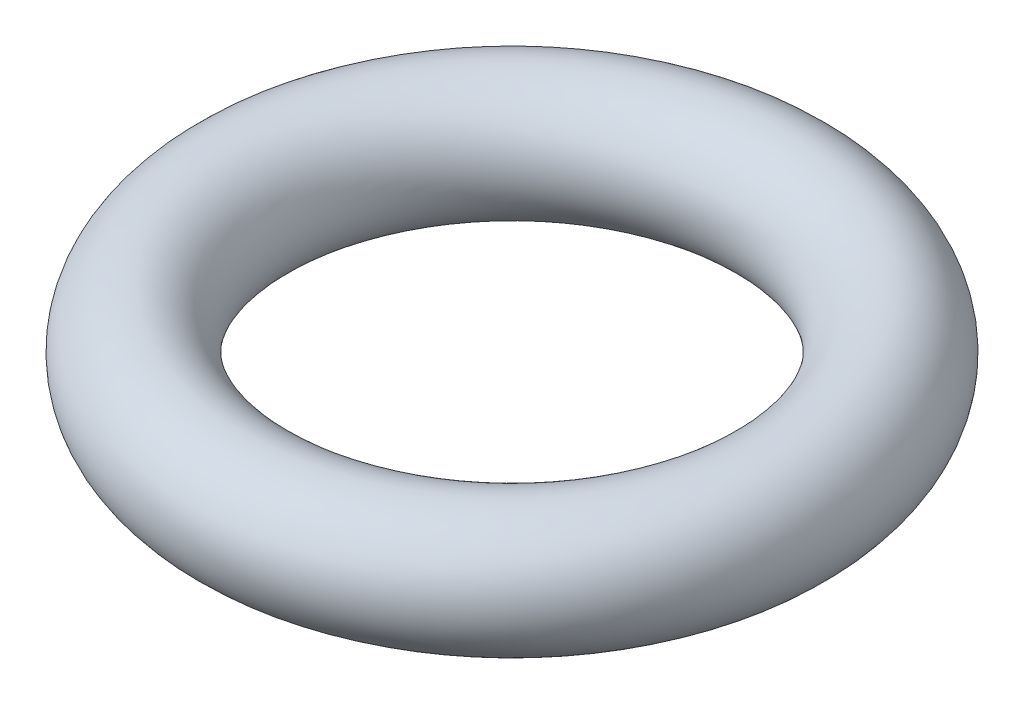
ISO-10303-21;
HEADER;
FILE_DESCRIPTION(('STEP AP214'),'2;1');
FILE_NAME('part.step','',(''),(''),'','','');
FILE_SCHEMA(('AUTOMOTIVE_DESIGN { 1 0 10303 214 1 1 1 1 }'));
ENDSEC;
DATA;
#1=APPLICATION_CONTEXT('core data for automotive mechanical design processes');
#2=APPLICATION_PROTOCOL_DEFINITION('international standard','automotive_design',2000,#1);
#3=PRODUCT_CONTEXT('',#1,'mechanical');
#4=PRODUCT('Part','Part','',(#3));
#5=PRODUCT_RELATED_PRODUCT_CATEGORY('part','',(#4));
#6=PRODUCT_DEFINITION_FORMATION('','',#4);
#7=PRODUCT_DEFINITION_CONTEXT('part definition',#1,'design');
#8=PRODUCT_DEFINITION('design','',#6,#7);
#9=PRODUCT_DEFINITION_SHAPE('','',#8);
#10=(LENGTH_UNIT() NAMED_UNIT(*) SI_UNIT(.MILLI.,.METRE.));
#11=(NAMED_UNIT(*) PLANE_ANGLE_UNIT() SI_UNIT($,.RADIAN.));
#12=(NAMED_UNIT(*) SI_UNIT($,.STERADIAN.) SOLID_ANGLE_UNIT());
#13=UNCERTAINTY_MEASURE_WITH_UNIT(LENGTH_MEASURE(1.E-05),#10,'distance_accuracy_value','');
#14=(GEOMETRIC_REPRESENTATION_CONTEXT(3) GLOBAL_UNCERTAINTY_ASSIGNED_CONTEXT((#13)) GLOBAL_UNIT_ASSIGNED_CONTEXT((#10,
#11,#12)) REPRESENTATION_CONTEXT('',''));
#15=CARTESIAN_POINT('',(0.,0.,0.));
#16=DIRECTION('',(0.,0.,1.));
#17=DIRECTION('',(1.,0.,0.));
#18=AXIS2_PLACEMENT_3D('',#15,#16,#17);
#19=CARTESIAN_POINT('',(0.,0.,0.));
#20=DIRECTION('',(0.,-1.,0.));
#21=DIRECTION('',(0.,0.,-1.));
#22=AXIS2_PLACEMENT_3D('',#19,#20,#21);
#23=TOROIDAL_SURFACE('',#22,3.9,0.899999999999999);
#24=CARTESIAN_POINT('',(0.,0.,-4.8));
#25=VERTEX_POINT('',#24);
#26=VERTEX_LOOP('',#25);
#27=FACE_BOUND('',#26,.T.);
#28=ADVANCED_FACE('F34',(#27),#23,.T.);
#29=CLOSED_SHELL('',(#28));
#30=MANIFOLD_SOLID_BREP('B2',#29);
#31=ADVANCED_BREP_SHAPE_REPRESENTATION('',(#18,#30),#14);
#32=SHAPE_DEFINITION_REPRESENTATION(#9,#31);
ENDSEC;
END-ISO-10303-21;
